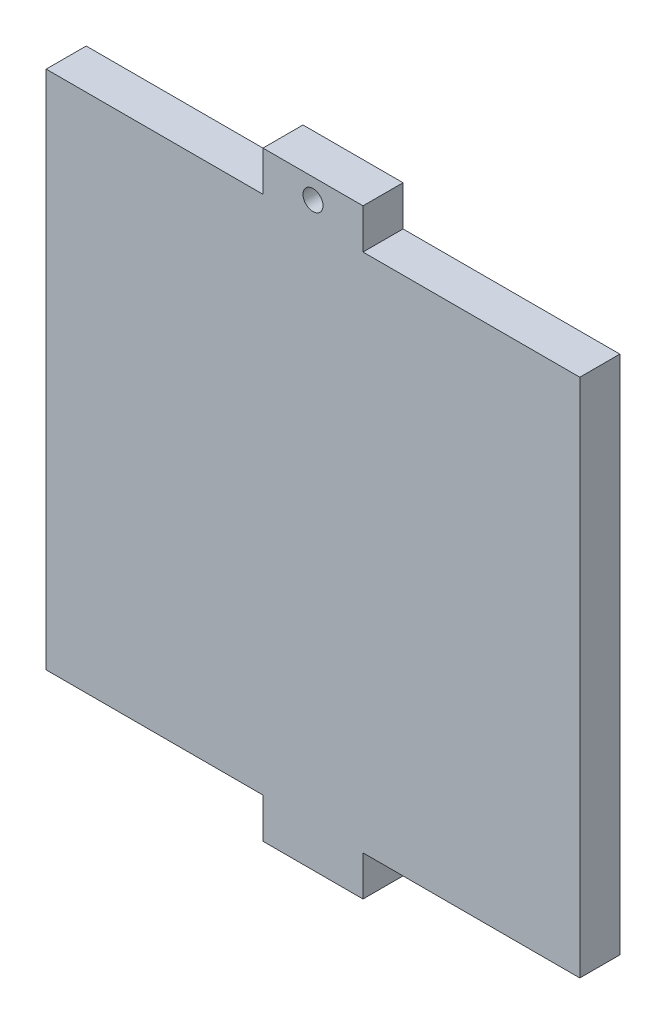
ISO-10303-21;
HEADER;
FILE_DESCRIPTION(('STEP AP214'),'2;1');
FILE_NAME('part.step','',(''),(''),'','','');
FILE_SCHEMA(('AUTOMOTIVE_DESIGN { 1 0 10303 214 1 1 1 1 }'));
ENDSEC;
DATA;
#1=APPLICATION_CONTEXT('core data for automotive mechanical design processes');
#2=APPLICATION_PROTOCOL_DEFINITION('international standard','automotive_design',2000,#1);
#3=PRODUCT_CONTEXT('',#1,'mechanical');
#4=PRODUCT('Part','Part','',(#3));
#5=PRODUCT_RELATED_PRODUCT_CATEGORY('part','',(#4));
#6=PRODUCT_DEFINITION_FORMATION('','',#4);
#7=PRODUCT_DEFINITION_CONTEXT('part definition',#1,'design');
#8=PRODUCT_DEFINITION('design','',#6,#7);
#9=PRODUCT_DEFINITION_SHAPE('','',#8);
#10=(LENGTH_UNIT() NAMED_UNIT(*) SI_UNIT(.MILLI.,.METRE.));
#11=(NAMED_UNIT(*) PLANE_ANGLE_UNIT() SI_UNIT($,.RADIAN.));
#12=(NAMED_UNIT(*) SI_UNIT($,.STERADIAN.) SOLID_ANGLE_UNIT());
#13=UNCERTAINTY_MEASURE_WITH_UNIT(LENGTH_MEASURE(1.E-05),#10,'distance_accuracy_value','');
#14=(GEOMETRIC_REPRESENTATION_CONTEXT(3) GLOBAL_UNCERTAINTY_ASSIGNED_CONTEXT((#13)) GLOBAL_UNIT_ASSIGNED_CONTEXT((#10,
#11,#12)) REPRESENTATION_CONTEXT('',''));
#15=CARTESIAN_POINT('',(0.,0.,0.));
#16=DIRECTION('',(0.,0.,1.));
#17=DIRECTION('',(1.,0.,0.));
#18=AXIS2_PLACEMENT_3D('',#15,#16,#17);
#19=CARTESIAN_POINT('',(-40.,81.,6.));
#20=DIRECTION('',(0.,0.,-1.));
#21=DIRECTION('',(-1.,0.,0.));
#22=AXIS2_PLACEMENT_3D('',#19,#20,#21);
#23=CYLINDRICAL_SURFACE('',#22,1.5);
#24=CARTESIAN_POINT('',(-40.,81.,6.));
#25=DIRECTION('',(0.,0.,-1.));
#26=DIRECTION('',(-1.,0.,0.));
#27=AXIS2_PLACEMENT_3D('',#24,#25,#26);
#28=CIRCLE('',#27,1.5);
#29=CARTESIAN_POINT('',(-41.5,81.,6.));
#30=VERTEX_POINT('',#29);
#31=EDGE_CURVE('E159',#30,#30,#28,.T.);
#32=ORIENTED_EDGE('',*,*,#31,.F.);
#33=EDGE_LOOP('',(#32));
#34=FACE_BOUND('',#33,.T.);
#35=CARTESIAN_POINT('',(-40.,81.,3.));
#36=DIRECTION('',(0.,0.,-1.));
#37=DIRECTION('',(-1.,0.,0.));
#38=AXIS2_PLACEMENT_3D('',#35,#36,#37);
#39=CIRCLE('',#38,1.5);
#40=CARTESIAN_POINT('',(-41.5,81.,3.));
#41=VERTEX_POINT('',#40);
#42=EDGE_CURVE('E37',#41,#41,#39,.F.);
#43=ORIENTED_EDGE('',*,*,#42,.F.);
#44=EDGE_LOOP('',(#43));
#45=FACE_BOUND('',#44,.T.);
#46=ADVANCED_FACE('F33',(#34,#45),#23,.F.);
#47=CARTESIAN_POINT('',(0.,0.,6.));
#48=DIRECTION('',(0.,1.,0.));
#49=DIRECTION('',(0.,0.,1.));
#50=AXIS2_PLACEMENT_3D('',#47,#48,#49);
#51=PLANE('',#50);
#52=DIRECTION('',(1.,0.,0.));
#53=VECTOR('',#52,1.);
#54=CARTESIAN_POINT('',(0.,0.,0.));
#55=LINE('',#54,#53);
#56=CARTESIAN_POINT('',(-32.5,0.,0.));
#57=VERTEX_POINT('',#56);
#58=CARTESIAN_POINT('',(0.,0.,0.));
#59=VERTEX_POINT('',#58);
#60=EDGE_CURVE('E155',#57,#59,#55,.T.);
#61=ORIENTED_EDGE('',*,*,#60,.T.);
#62=DIRECTION('',(0.,0.,-1.));
#63=VECTOR('',#62,1.);
#64=CARTESIAN_POINT('',(0.,0.,6.));
#65=LINE('',#64,#63);
#66=CARTESIAN_POINT('',(0.,0.,6.));
#67=VERTEX_POINT('',#66);
#68=EDGE_CURVE('E11',#67,#59,#65,.T.);
#69=ORIENTED_EDGE('',*,*,#68,.F.);
#70=DIRECTION('',(1.,0.,0.));
#71=VECTOR('',#70,1.);
#72=CARTESIAN_POINT('',(0.,0.,6.));
#73=LINE('',#72,#71);
#74=CARTESIAN_POINT('',(-32.5,0.,6.));
#75=VERTEX_POINT('',#74);
#76=EDGE_CURVE('E178',#75,#67,#73,.T.);
#77=ORIENTED_EDGE('',*,*,#76,.F.);
#78=DIRECTION('',(0.,0.,-1.));
#79=VECTOR('',#78,1.);
#80=CARTESIAN_POINT('',(-32.5,0.,6.));
#81=LINE('',#80,#79);
#82=EDGE_CURVE('E151',#75,#57,#81,.T.);
#83=ORIENTED_EDGE('',*,*,#82,.T.);
#84=EDGE_LOOP('',(#61,#69,#77,#83));
#85=FACE_BOUND('',#84,.T.);
#86=ADVANCED_FACE('F35',(#85),#51,.F.);
#87=CARTESIAN_POINT('',(0.,0.,6.));
#88=DIRECTION('',(-1.,0.,0.));
#89=DIRECTION('',(0.,-1.,0.));
#90=AXIS2_PLACEMENT_3D('',#87,#88,#89);
#91=PLANE('',#90);
#92=DIRECTION('',(0.,1.,0.));
#93=VECTOR('',#92,1.);
#94=CARTESIAN_POINT('',(0.,0.,0.));
#95=LINE('',#94,#93);
#96=CARTESIAN_POINT('',(0.,78.,0.));
#97=VERTEX_POINT('',#96);
#98=EDGE_CURVE('E158',#59,#97,#95,.T.);
#99=ORIENTED_EDGE('',*,*,#98,.T.);
#100=DIRECTION('',(0.,0.,-1.));
#101=VECTOR('',#100,1.);
#102=CARTESIAN_POINT('',(0.,78.,6.));
#103=LINE('',#102,#101);
#104=CARTESIAN_POINT('',(0.,78.,6.));
#105=VERTEX_POINT('',#104);
#106=EDGE_CURVE('E43',#105,#97,#103,.T.);
#107=ORIENTED_EDGE('',*,*,#106,.F.);
#108=DIRECTION('',(0.,1.,0.));
#109=VECTOR('',#108,1.);
#110=CARTESIAN_POINT('',(0.,0.,6.));
#111=LINE('',#110,#109);
#112=EDGE_CURVE('E106',#67,#105,#111,.T.);
#113=ORIENTED_EDGE('',*,*,#112,.F.);
#114=ORIENTED_EDGE('',*,*,#68,.T.);
#115=EDGE_LOOP('',(#99,#107,#113,#114));
#116=FACE_BOUND('',#115,.T.);
#117=ADVANCED_FACE('F266',(#116),#91,.F.);
#118=CARTESIAN_POINT('',(0.,78.,6.));
#119=DIRECTION('',(0.,-1.,0.));
#120=DIRECTION('',(1.,0.,0.));
#121=AXIS2_PLACEMENT_3D('',#118,#119,#120);
#122=PLANE('',#121);
#123=DIRECTION('',(-1.,0.,0.));
#124=VECTOR('',#123,1.);
#125=CARTESIAN_POINT('',(0.,78.,0.));
#126=LINE('',#125,#124);
#127=CARTESIAN_POINT('',(-32.5,78.,0.));
#128=VERTEX_POINT('',#127);
#129=EDGE_CURVE('E161',#97,#128,#126,.T.);
#130=ORIENTED_EDGE('',*,*,#129,.T.);
#131=DIRECTION('',(0.,0.,-1.));
#132=VECTOR('',#131,1.);
#133=CARTESIAN_POINT('',(-32.5,78.,6.));
#134=LINE('',#133,#132);
#135=CARTESIAN_POINT('',(-32.5,78.,6.));
#136=VERTEX_POINT('',#135);
#137=EDGE_CURVE('E197',#136,#128,#134,.T.);
#138=ORIENTED_EDGE('',*,*,#137,.F.);
#139=DIRECTION('',(-1.,0.,0.));
#140=VECTOR('',#139,1.);
#141=CARTESIAN_POINT('',(0.,78.,6.));
#142=LINE('',#141,#140);
#143=EDGE_CURVE('E206',#105,#136,#142,.T.);
#144=ORIENTED_EDGE('',*,*,#143,.F.);
#145=ORIENTED_EDGE('',*,*,#106,.T.);
#146=EDGE_LOOP('',(#130,#138,#144,#145));
#147=FACE_BOUND('',#146,.T.);
#148=ADVANCED_FACE('F204',(#147),#122,.F.);
#149=CARTESIAN_POINT('',(-32.5,78.,6.));
#150=DIRECTION('',(-1.,0.,0.));
#151=DIRECTION('',(0.,0.,1.));
#152=AXIS2_PLACEMENT_3D('',#149,#150,#151);
#153=PLANE('',#152);
#154=DIRECTION('',(0.,1.,0.));
#155=VECTOR('',#154,1.);
#156=CARTESIAN_POINT('',(-32.5,78.,0.));
#157=LINE('',#156,#155);
#158=CARTESIAN_POINT('',(-32.5,84.,0.));
#159=VERTEX_POINT('',#158);
#160=EDGE_CURVE('E163',#128,#159,#157,.T.);
#161=ORIENTED_EDGE('',*,*,#160,.T.);
#162=DIRECTION('',(0.,0.,-1.));
#163=VECTOR('',#162,1.);
#164=CARTESIAN_POINT('',(-32.5,84.,6.));
#165=LINE('',#164,#163);
#166=CARTESIAN_POINT('',(-32.5,84.,6.));
#167=VERTEX_POINT('',#166);
#168=EDGE_CURVE('E194',#167,#159,#165,.T.);
#169=ORIENTED_EDGE('',*,*,#168,.F.);
#170=DIRECTION('',(0.,1.,0.));
#171=VECTOR('',#170,1.);
#172=CARTESIAN_POINT('',(-32.5,78.,6.));
#173=LINE('',#172,#171);
#174=EDGE_CURVE('E224',#136,#167,#173,.T.);
#175=ORIENTED_EDGE('',*,*,#174,.F.);
#176=ORIENTED_EDGE('',*,*,#137,.T.);
#177=EDGE_LOOP('',(#161,#169,#175,#176));
#178=FACE_BOUND('',#177,.T.);
#179=ADVANCED_FACE('F215',(#178),#153,.F.);
#180=CARTESIAN_POINT('',(-47.5,84.,6.));
#181=DIRECTION('',(0.,-1.,0.));
#182=DIRECTION('',(1.,0.,0.));
#183=AXIS2_PLACEMENT_3D('',#180,#181,#182);
#184=PLANE('',#183);
#185=DIRECTION('',(-1.,0.,0.));
#186=VECTOR('',#185,1.);
#187=CARTESIAN_POINT('',(-47.5,84.,0.));
#188=LINE('',#187,#186);
#189=CARTESIAN_POINT('',(-47.5,84.,0.));
#190=VERTEX_POINT('',#189);
#191=EDGE_CURVE('E165',#159,#190,#188,.T.);
#192=ORIENTED_EDGE('',*,*,#191,.T.);
#193=DIRECTION('',(0.,0.,-1.));
#194=VECTOR('',#193,1.);
#195=CARTESIAN_POINT('',(-47.5,84.,6.));
#196=LINE('',#195,#194);
#197=CARTESIAN_POINT('',(-47.5,84.,6.));
#198=VERTEX_POINT('',#197);
#199=EDGE_CURVE('E191',#198,#190,#196,.T.);
#200=ORIENTED_EDGE('',*,*,#199,.F.);
#201=DIRECTION('',(-1.,0.,0.));
#202=VECTOR('',#201,1.);
#203=CARTESIAN_POINT('',(-47.5,84.,6.));
#204=LINE('',#203,#202);
#205=EDGE_CURVE('E221',#167,#198,#204,.T.);
#206=ORIENTED_EDGE('',*,*,#205,.F.);
#207=ORIENTED_EDGE('',*,*,#168,.T.);
#208=EDGE_LOOP('',(#192,#200,#206,#207));
#209=FACE_BOUND('',#208,.T.);
#210=ADVANCED_FACE('F219',(#209),#184,.F.);
#211=CARTESIAN_POINT('',(-47.5,78.,6.));
#212=DIRECTION('',(1.,0.,0.));
#213=DIRECTION('',(0.,0.,-1.));
#214=AXIS2_PLACEMENT_3D('',#211,#212,#213);
#215=PLANE('',#214);
#216=DIRECTION('',(0.,-1.,0.));
#217=VECTOR('',#216,1.);
#218=CARTESIAN_POINT('',(-47.5,78.,0.));
#219=LINE('',#218,#217);
#220=CARTESIAN_POINT('',(-47.5,78.,0.));
#221=VERTEX_POINT('',#220);
#222=EDGE_CURVE('E167',#190,#221,#219,.T.);
#223=ORIENTED_EDGE('',*,*,#222,.T.);
#224=DIRECTION('',(0.,0.,-1.));
#225=VECTOR('',#224,1.);
#226=CARTESIAN_POINT('',(-47.5,78.,6.));
#227=LINE('',#226,#225);
#228=CARTESIAN_POINT('',(-47.5,78.,6.));
#229=VERTEX_POINT('',#228);
#230=EDGE_CURVE('E188',#229,#221,#227,.T.);
#231=ORIENTED_EDGE('',*,*,#230,.F.);
#232=DIRECTION('',(0.,-1.,0.));
#233=VECTOR('',#232,1.);
#234=CARTESIAN_POINT('',(-47.5,78.,6.));
#235=LINE('',#234,#233);
#236=EDGE_CURVE('E223',#198,#229,#235,.T.);
#237=ORIENTED_EDGE('',*,*,#236,.F.);
#238=ORIENTED_EDGE('',*,*,#199,.T.);
#239=EDGE_LOOP('',(#223,#231,#237,#238));
#240=FACE_BOUND('',#239,.T.);
#241=ADVANCED_FACE('F356',(#240),#215,.F.);
#242=CARTESIAN_POINT('',(-47.5,78.,6.));
#243=DIRECTION('',(0.,-1.,0.));
#244=DIRECTION('',(1.,0.,0.));
#245=AXIS2_PLACEMENT_3D('',#242,#243,#244);
#246=PLANE('',#245);
#247=DIRECTION('',(-1.,0.,0.));
#248=VECTOR('',#247,1.);
#249=CARTESIAN_POINT('',(-47.5,78.,0.));
#250=LINE('',#249,#248);
#251=CARTESIAN_POINT('',(-80.,78.,0.));
#252=VERTEX_POINT('',#251);
#253=EDGE_CURVE('E169',#221,#252,#250,.T.);
#254=ORIENTED_EDGE('',*,*,#253,.T.);
#255=DIRECTION('',(0.,0.,-1.));
#256=VECTOR('',#255,1.);
#257=CARTESIAN_POINT('',(-80.,78.,6.));
#258=LINE('',#257,#256);
#259=CARTESIAN_POINT('',(-80.,78.,6.));
#260=VERTEX_POINT('',#259);
#261=EDGE_CURVE('E185',#260,#252,#258,.T.);
#262=ORIENTED_EDGE('',*,*,#261,.F.);
#263=DIRECTION('',(-1.,0.,0.));
#264=VECTOR('',#263,1.);
#265=CARTESIAN_POINT('',(-47.5,78.,6.));
#266=LINE('',#265,#264);
#267=EDGE_CURVE('E226',#229,#260,#266,.T.);
#268=ORIENTED_EDGE('',*,*,#267,.F.);
#269=ORIENTED_EDGE('',*,*,#230,.T.);
#270=EDGE_LOOP('',(#254,#262,#268,#269));
#271=FACE_BOUND('',#270,.T.);
#272=ADVANCED_FACE('F348',(#271),#246,.F.);
#273=CARTESIAN_POINT('',(-80.,0.,6.));
#274=DIRECTION('',(1.,0.,0.));
#275=DIRECTION('',(0.,0.,-1.));
#276=AXIS2_PLACEMENT_3D('',#273,#274,#275);
#277=PLANE('',#276);
#278=DIRECTION('',(0.,-1.,0.));
#279=VECTOR('',#278,1.);
#280=CARTESIAN_POINT('',(-80.,0.,0.));
#281=LINE('',#280,#279);
#282=CARTESIAN_POINT('',(-80.,0.,0.));
#283=VERTEX_POINT('',#282);
#284=EDGE_CURVE('E171',#252,#283,#281,.T.);
#285=ORIENTED_EDGE('',*,*,#284,.T.);
#286=DIRECTION('',(0.,0.,-1.));
#287=VECTOR('',#286,1.);
#288=CARTESIAN_POINT('',(-80.,0.,6.));
#289=LINE('',#288,#287);
#290=CARTESIAN_POINT('',(-80.,0.,6.));
#291=VERTEX_POINT('',#290);
#292=EDGE_CURVE('E182',#291,#283,#289,.T.);
#293=ORIENTED_EDGE('',*,*,#292,.F.);
#294=DIRECTION('',(0.,-1.,0.));
#295=VECTOR('',#294,1.);
#296=CARTESIAN_POINT('',(-80.,0.,6.));
#297=LINE('',#296,#295);
#298=EDGE_CURVE('E232',#260,#291,#297,.T.);
#299=ORIENTED_EDGE('',*,*,#298,.F.);
#300=ORIENTED_EDGE('',*,*,#261,.T.);
#301=EDGE_LOOP('',(#285,#293,#299,#300));
#302=FACE_BOUND('',#301,.T.);
#303=ADVANCED_FACE('F238',(#302),#277,.F.);
#304=CARTESIAN_POINT('',(-47.5,0.,6.));
#305=DIRECTION('',(0.,1.,0.));
#306=DIRECTION('',(-1.,0.,0.));
#307=AXIS2_PLACEMENT_3D('',#304,#305,#306);
#308=PLANE('',#307);
#309=DIRECTION('',(1.,0.,0.));
#310=VECTOR('',#309,1.);
#311=CARTESIAN_POINT('',(-47.5,0.,0.));
#312=LINE('',#311,#310);
#313=CARTESIAN_POINT('',(-47.5,0.,0.));
#314=VERTEX_POINT('',#313);
#315=EDGE_CURVE('E173',#283,#314,#312,.T.);
#316=ORIENTED_EDGE('',*,*,#315,.T.);
#317=DIRECTION('',(0.,0.,-1.));
#318=VECTOR('',#317,1.);
#319=CARTESIAN_POINT('',(-47.5,0.,6.));
#320=LINE('',#319,#318);
#321=CARTESIAN_POINT('',(-47.5,0.,6.));
#322=VERTEX_POINT('',#321);
#323=EDGE_CURVE('E146',#322,#314,#320,.T.);
#324=ORIENTED_EDGE('',*,*,#323,.F.);
#325=DIRECTION('',(1.,0.,0.));
#326=VECTOR('',#325,1.);
#327=CARTESIAN_POINT('',(-47.5,0.,6.));
#328=LINE('',#327,#326);
#329=EDGE_CURVE('E137',#291,#322,#328,.T.);
#330=ORIENTED_EDGE('',*,*,#329,.F.);
#331=ORIENTED_EDGE('',*,*,#292,.T.);
#332=EDGE_LOOP('',(#316,#324,#330,#331));
#333=FACE_BOUND('',#332,.T.);
#334=ADVANCED_FACE('F242',(#333),#308,.F.);
#335=CARTESIAN_POINT('',(-47.5,0.,6.));
#336=DIRECTION('',(1.,0.,0.));
#337=DIRECTION('',(0.,0.,-1.));
#338=AXIS2_PLACEMENT_3D('',#335,#336,#337);
#339=PLANE('',#338);
#340=DIRECTION('',(0.,-1.,0.));
#341=VECTOR('',#340,1.);
#342=CARTESIAN_POINT('',(-47.5,0.,0.));
#343=LINE('',#342,#341);
#344=CARTESIAN_POINT('',(-47.5,-6.00000000000001,0.));
#345=VERTEX_POINT('',#344);
#346=EDGE_CURVE('E145',#314,#345,#343,.T.);
#347=ORIENTED_EDGE('',*,*,#346,.T.);
#348=DIRECTION('',(0.,0.,-1.));
#349=VECTOR('',#348,1.);
#350=CARTESIAN_POINT('',(-47.5,-6.00000000000001,6.));
#351=LINE('',#350,#349);
#352=CARTESIAN_POINT('',(-47.5,-6.00000000000001,6.));
#353=VERTEX_POINT('',#352);
#354=EDGE_CURVE('E142',#353,#345,#351,.T.);
#355=ORIENTED_EDGE('',*,*,#354,.F.);
#356=DIRECTION('',(0.,-1.,0.));
#357=VECTOR('',#356,1.);
#358=CARTESIAN_POINT('',(-47.5,0.,6.));
#359=LINE('',#358,#357);
#360=EDGE_CURVE('E131',#322,#353,#359,.T.);
#361=ORIENTED_EDGE('',*,*,#360,.F.);
#362=ORIENTED_EDGE('',*,*,#323,.T.);
#363=EDGE_LOOP('',(#347,#355,#361,#362));
#364=FACE_BOUND('',#363,.T.);
#365=ADVANCED_FACE('F143',(#364),#339,.F.);
#366=CARTESIAN_POINT('',(-47.5,-6.00000000000001,6.));
#367=DIRECTION('',(0.,1.,0.));
#368=DIRECTION('',(-1.,0.,0.));
#369=AXIS2_PLACEMENT_3D('',#366,#367,#368);
#370=PLANE('',#369);
#371=DIRECTION('',(1.,0.,0.));
#372=VECTOR('',#371,1.);
#373=CARTESIAN_POINT('',(-47.5,-6.00000000000001,0.));
#374=LINE('',#373,#372);
#375=CARTESIAN_POINT('',(-32.5,-5.99999999999999,0.));
#376=VERTEX_POINT('',#375);
#377=EDGE_CURVE('E92',#345,#376,#374,.T.);
#378=ORIENTED_EDGE('',*,*,#377,.T.);
#379=DIRECTION('',(0.,0.,-1.));
#380=VECTOR('',#379,1.);
#381=CARTESIAN_POINT('',(-32.5,-5.99999999999999,6.));
#382=LINE('',#381,#380);
#383=CARTESIAN_POINT('',(-32.5,-5.99999999999999,6.));
#384=VERTEX_POINT('',#383);
#385=EDGE_CURVE('E147',#384,#376,#382,.T.);
#386=ORIENTED_EDGE('',*,*,#385,.F.);
#387=DIRECTION('',(1.,0.,0.));
#388=VECTOR('',#387,1.);
#389=CARTESIAN_POINT('',(-47.5,-6.00000000000001,6.));
#390=LINE('',#389,#388);
#391=EDGE_CURVE('E135',#353,#384,#390,.T.);
#392=ORIENTED_EDGE('',*,*,#391,.F.);
#393=ORIENTED_EDGE('',*,*,#354,.T.);
#394=EDGE_LOOP('',(#378,#386,#392,#393));
#395=FACE_BOUND('',#394,.T.);
#396=ADVANCED_FACE('F149',(#395),#370,.F.);
#397=CARTESIAN_POINT('',(-32.5,0.,6.));
#398=DIRECTION('',(-1.,0.,0.));
#399=DIRECTION('',(0.,0.,1.));
#400=AXIS2_PLACEMENT_3D('',#397,#398,#399);
#401=PLANE('',#400);
#402=DIRECTION('',(0.,1.,0.));
#403=VECTOR('',#402,1.);
#404=CARTESIAN_POINT('',(-32.5,0.,0.));
#405=LINE('',#404,#403);
#406=EDGE_CURVE('E98',#376,#57,#405,.T.);
#407=ORIENTED_EDGE('',*,*,#406,.T.);
#408=ORIENTED_EDGE('',*,*,#82,.F.);
#409=DIRECTION('',(0.,1.,0.));
#410=VECTOR('',#409,1.);
#411=CARTESIAN_POINT('',(-32.5,0.,6.));
#412=LINE('',#411,#410);
#413=EDGE_CURVE('E51',#384,#75,#412,.T.);
#414=ORIENTED_EDGE('',*,*,#413,.F.);
#415=ORIENTED_EDGE('',*,*,#385,.T.);
#416=EDGE_LOOP('',(#407,#408,#414,#415));
#417=FACE_BOUND('',#416,.T.);
#418=ADVANCED_FACE('F246',(#417),#401,.F.);
#419=CARTESIAN_POINT('',(0.,0.,6.));
#420=DIRECTION('',(0.,0.,1.));
#421=DIRECTION('',(1.,0.,0.));
#422=AXIS2_PLACEMENT_3D('',#419,#420,#421);
#423=PLANE('',#422);
#424=ORIENTED_EDGE('',*,*,#31,.T.);
#425=EDGE_LOOP('',(#424));
#426=FACE_BOUND('',#425,.T.);
#427=ORIENTED_EDGE('',*,*,#76,.T.);
#428=ORIENTED_EDGE('',*,*,#112,.T.);
#429=ORIENTED_EDGE('',*,*,#143,.T.);
#430=ORIENTED_EDGE('',*,*,#174,.T.);
#431=ORIENTED_EDGE('',*,*,#205,.T.);
#432=ORIENTED_EDGE('',*,*,#236,.T.);
#433=ORIENTED_EDGE('',*,*,#267,.T.);
#434=ORIENTED_EDGE('',*,*,#298,.T.);
#435=ORIENTED_EDGE('',*,*,#329,.T.);
#436=ORIENTED_EDGE('',*,*,#360,.T.);
#437=ORIENTED_EDGE('',*,*,#391,.T.);
#438=ORIENTED_EDGE('',*,*,#413,.T.);
#439=EDGE_LOOP('',(#427,#428,#429,#430,#431,#432,#433,#434,#435,#436,#437,#438));
#440=FACE_BOUND('',#439,.T.);
#441=ADVANCED_FACE('F133',(#426,#440),#423,.T.);
#442=CARTESIAN_POINT('',(0.,0.,0.));
#443=DIRECTION('',(0.,0.,1.));
#444=DIRECTION('',(1.,0.,0.));
#445=AXIS2_PLACEMENT_3D('',#442,#443,#444);
#446=PLANE('',#445);
#447=CARTESIAN_POINT('',(-40.,81.,0.));
#448=DIRECTION('',(0.,0.,-1.));
#449=DIRECTION('',(-1.,0.,0.));
#450=AXIS2_PLACEMENT_3D('',#447,#448,#449);
#451=CIRCLE('',#450,2.99499999999999);
#452=CARTESIAN_POINT('',(-42.995,81.,0.));
#453=VERTEX_POINT('',#452);
#454=EDGE_CURVE('E280',#453,#453,#451,.T.);
#455=ORIENTED_EDGE('',*,*,#454,.F.);
#456=EDGE_LOOP('',(#455));
#457=FACE_BOUND('',#456,.T.);
#458=ORIENTED_EDGE('',*,*,#60,.F.);
#459=ORIENTED_EDGE('',*,*,#406,.F.);
#460=ORIENTED_EDGE('',*,*,#377,.F.);
#461=ORIENTED_EDGE('',*,*,#346,.F.);
#462=ORIENTED_EDGE('',*,*,#315,.F.);
#463=ORIENTED_EDGE('',*,*,#284,.F.);
#464=ORIENTED_EDGE('',*,*,#253,.F.);
#465=ORIENTED_EDGE('',*,*,#222,.F.);
#466=ORIENTED_EDGE('',*,*,#191,.F.);
#467=ORIENTED_EDGE('',*,*,#160,.F.);
#468=ORIENTED_EDGE('',*,*,#129,.F.);
#469=ORIENTED_EDGE('',*,*,#98,.F.);
#470=EDGE_LOOP('',(#458,#459,#460,#461,#462,#463,#464,#465,#466,#467,#468,#469));
#471=FACE_BOUND('',#470,.T.);
#472=ADVANCED_FACE('F210',(#457,#471),#446,.F.);
#473=CARTESIAN_POINT('',(-40.,81.,3.));
#474=DIRECTION('',(0.,0.,-1.));
#475=DIRECTION('',(-1.,0.,0.));
#476=AXIS2_PLACEMENT_3D('',#473,#474,#475);
#477=PLANE('',#476);
#478=CARTESIAN_POINT('',(-40.,81.,3.));
#479=DIRECTION('',(0.,0.,-1.));
#480=DIRECTION('',(-1.,0.,0.));
#481=AXIS2_PLACEMENT_3D('',#478,#479,#480);
#482=CIRCLE('',#481,2.99499999999999);
#483=CARTESIAN_POINT('',(-42.995,81.,3.));
#484=VERTEX_POINT('',#483);
#485=EDGE_CURVE('E282',#484,#484,#482,.T.);
#486=ORIENTED_EDGE('',*,*,#485,.T.);
#487=EDGE_LOOP('',(#486));
#488=FACE_BOUND('',#487,.T.);
#489=ORIENTED_EDGE('',*,*,#42,.T.);
#490=EDGE_LOOP('',(#489));
#491=FACE_BOUND('',#490,.T.);
#492=ADVANCED_FACE('F273',(#488,#491),#477,.T.);
#493=CARTESIAN_POINT('',(-40.,81.,3.));
#494=DIRECTION('',(0.,0.,-1.));
#495=DIRECTION('',(-1.,0.,0.));
#496=AXIS2_PLACEMENT_3D('',#493,#494,#495);
#497=CYLINDRICAL_SURFACE('',#496,2.99499999999999);
#498=ORIENTED_EDGE('',*,*,#485,.F.);
#499=EDGE_LOOP('',(#498));
#500=FACE_BOUND('',#499,.T.);
#501=ORIENTED_EDGE('',*,*,#454,.T.);
#502=EDGE_LOOP('',(#501));
#503=FACE_BOUND('',#502,.T.);
#504=ADVANCED_FACE('F270',(#500,#503),#497,.F.);
#505=CLOSED_SHELL('',(#46,#86,#117,#148,#179,#210,#241,#272,#303,#334,#365,#396,#418,#441,#472,
#492,#504));
#506=MANIFOLD_SOLID_BREP('B2',#505);
#507=ADVANCED_BREP_SHAPE_REPRESENTATION('',(#18,#506),#14);
#508=SHAPE_DEFINITION_REPRESENTATION(#9,#507);
ENDSEC;
END-ISO-10303-21;
